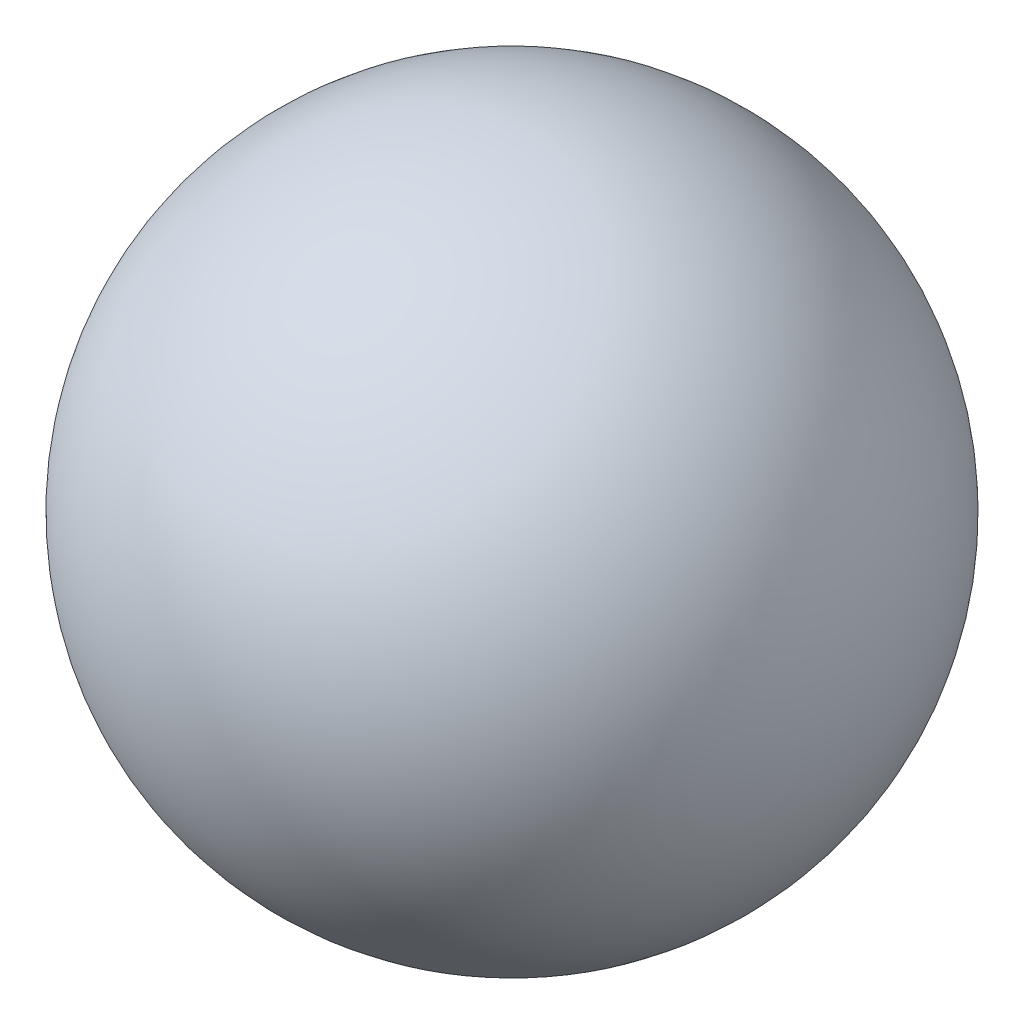
ISO-10303-21;
HEADER;
FILE_DESCRIPTION(('STEP AP214'),'2;1');
FILE_NAME('part.step','',(''),(''),'','','');
FILE_SCHEMA(('AUTOMOTIVE_DESIGN { 1 0 10303 214 1 1 1 1 }'));
ENDSEC;
DATA;
#1=APPLICATION_CONTEXT('core data for automotive mechanical design processes');
#2=APPLICATION_PROTOCOL_DEFINITION('international standard','automotive_design',2000,#1);
#3=PRODUCT_CONTEXT('',#1,'mechanical');
#4=PRODUCT('Part','Part','',(#3));
#5=PRODUCT_RELATED_PRODUCT_CATEGORY('part','',(#4));
#6=PRODUCT_DEFINITION_FORMATION('','',#4);
#7=PRODUCT_DEFINITION_CONTEXT('part definition',#1,'design');
#8=PRODUCT_DEFINITION('design','',#6,#7);
#9=PRODUCT_DEFINITION_SHAPE('','',#8);
#10=(LENGTH_UNIT() NAMED_UNIT(*) SI_UNIT(.MILLI.,.METRE.));
#11=(NAMED_UNIT(*) PLANE_ANGLE_UNIT() SI_UNIT($,.RADIAN.));
#12=(NAMED_UNIT(*) SI_UNIT($,.STERADIAN.) SOLID_ANGLE_UNIT());
#13=UNCERTAINTY_MEASURE_WITH_UNIT(LENGTH_MEASURE(1.E-05),#10,'distance_accuracy_value','');
#14=(GEOMETRIC_REPRESENTATION_CONTEXT(3) GLOBAL_UNCERTAINTY_ASSIGNED_CONTEXT((#13)) GLOBAL_UNIT_ASSIGNED_CONTEXT((#10,
#11,#12)) REPRESENTATION_CONTEXT('',''));
#15=CARTESIAN_POINT('',(0.,0.,0.));
#16=DIRECTION('',(0.,0.,1.));
#17=DIRECTION('',(1.,0.,0.));
#18=AXIS2_PLACEMENT_3D('',#15,#16,#17);
#19=CARTESIAN_POINT('',(0.,15.0993938966423,0.));
#20=DIRECTION('',(0.,-1.,0.));
#21=DIRECTION('',(-1.,0.,0.));
#22=AXIS2_PLACEMENT_3D('',#19,#20,#21);
#23=SPHERICAL_SURFACE('',#22,15.0993938966423);
#24=CARTESIAN_POINT('',(0.,0.301025876959902,0.));
#25=DIRECTION('',(0.,1.,0.));
#26=DIRECTION('',(0.,0.,1.));
#27=AXIS2_PLACEMENT_3D('',#24,#25,#26);
#28=CIRCLE('',#27,3.);
#29=CARTESIAN_POINT('',(0.,0.301025876959902,3.));
#30=VERTEX_POINT('',#29);
#31=EDGE_CURVE('E10',#30,#30,#28,.F.);
#32=ORIENTED_EDGE('',*,*,#31,.F.);
#33=EDGE_LOOP('',(#32));
#34=FACE_BOUND('',#33,.T.);
#35=ADVANCED_FACE('F35',(#34),#23,.T.);
#36=CARTESIAN_POINT('',(0.,17.,0.));
#37=DIRECTION('',(0.,-1.,0.));
#38=DIRECTION('',(0.,0.,-1.));
#39=AXIS2_PLACEMENT_3D('',#36,#37,#38);
#40=CYLINDRICAL_SURFACE('',#39,3.);
#41=CARTESIAN_POINT('',(0.,5.5600018824728,0.));
#42=DIRECTION('',(0.,1.,0.));
#43=DIRECTION('',(0.,0.,1.));
#44=AXIS2_PLACEMENT_3D('',#41,#42,#43);
#45=CIRCLE('',#44,3.);
#46=CARTESIAN_POINT('',(0.,5.5600018824728,3.));
#47=VERTEX_POINT('',#46);
#48=EDGE_CURVE('E39',#47,#47,#45,.F.);
#49=ORIENTED_EDGE('',*,*,#48,.F.);
#50=EDGE_LOOP('',(#49));
#51=FACE_BOUND('',#50,.T.);
#52=ORIENTED_EDGE('',*,*,#31,.T.);
#53=EDGE_LOOP('',(#52));
#54=FACE_BOUND('',#53,.T.);
#55=ADVANCED_FACE('F49',(#51,#54),#40,.F.);
#56=CARTESIAN_POINT('',(0.,15.0993938966423,0.));
#57=DIRECTION('',(0.,-1.,0.));
#58=DIRECTION('',(-1.,0.,0.));
#59=AXIS2_PLACEMENT_3D('',#56,#57,#58);
#60=SPHERICAL_SURFACE('',#59,10.);
#61=ORIENTED_EDGE('',*,*,#48,.T.);
#62=EDGE_LOOP('',(#61));
#63=FACE_BOUND('',#62,.T.);
#64=ADVANCED_FACE('F37',(#63),#60,.F.);
#65=CLOSED_SHELL('',(#35,#55,#64));
#66=MANIFOLD_SOLID_BREP('B2',#65);
#67=ADVANCED_BREP_SHAPE_REPRESENTATION('',(#18,#66),#14);
#68=SHAPE_DEFINITION_REPRESENTATION(#9,#67);
ENDSEC;
END-ISO-10303-21;
